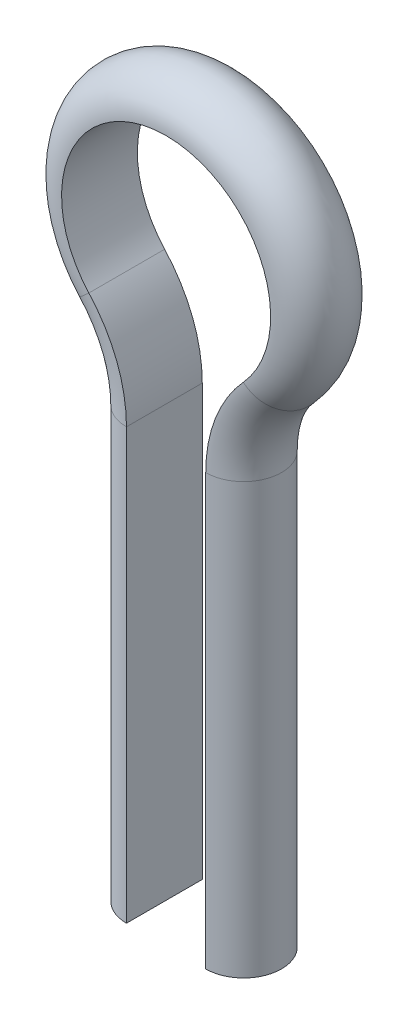
ISO-10303-21;
HEADER;
FILE_DESCRIPTION(('STEP AP214'),'2;1');
FILE_NAME('part.step','',(''),(''),'','','');
FILE_SCHEMA(('AUTOMOTIVE_DESIGN { 1 0 10303 214 1 1 1 1 }'));
ENDSEC;
DATA;
#1=APPLICATION_CONTEXT('core data for automotive mechanical design processes');
#2=APPLICATION_PROTOCOL_DEFINITION('international standard','automotive_design',2000,#1);
#3=PRODUCT_CONTEXT('',#1,'mechanical');
#4=PRODUCT('Part','Part','',(#3));
#5=PRODUCT_RELATED_PRODUCT_CATEGORY('part','',(#4));
#6=PRODUCT_DEFINITION_FORMATION('','',#4);
#7=PRODUCT_DEFINITION_CONTEXT('part definition',#1,'design');
#8=PRODUCT_DEFINITION('design','',#6,#7);
#9=PRODUCT_DEFINITION_SHAPE('','',#8);
#10=(LENGTH_UNIT() NAMED_UNIT(*) SI_UNIT(.MILLI.,.METRE.));
#11=(NAMED_UNIT(*) PLANE_ANGLE_UNIT() SI_UNIT($,.RADIAN.));
#12=(NAMED_UNIT(*) SI_UNIT($,.STERADIAN.) SOLID_ANGLE_UNIT());
#13=UNCERTAINTY_MEASURE_WITH_UNIT(LENGTH_MEASURE(1.E-05),#10,'distance_accuracy_value','');
#14=(GEOMETRIC_REPRESENTATION_CONTEXT(3) GLOBAL_UNCERTAINTY_ASSIGNED_CONTEXT((#13)) GLOBAL_UNIT_ASSIGNED_CONTEXT((#10,
#11,#12)) REPRESENTATION_CONTEXT('',''));
#15=CARTESIAN_POINT('',(0.,0.,0.));
#16=DIRECTION('',(0.,0.,1.));
#17=DIRECTION('',(1.,0.,0.));
#18=AXIS2_PLACEMENT_3D('',#15,#16,#17);
#19=CARTESIAN_POINT('',(-15.5057039775976,0.,-0.117647506402781));
#20=DIRECTION('',(0.,-1.,0.));
#21=DIRECTION('',(0.,0.,1.));
#22=AXIS2_PLACEMENT_3D('',#19,#20,#21);
#23=PLANE('',#22);
#24=CARTESIAN_POINT('',(-15.5057039775976,0.,-0.117647506402781));
#25=DIRECTION('',(0.,-1.,0.));
#26=DIRECTION('',(0.,0.,1.));
#27=AXIS2_PLACEMENT_3D('',#24,#25,#26);
#28=CIRCLE('',#27,5.17649028173649);
#29=CARTESIAN_POINT('',(-15.5057039775976,0.,5.0588427753337));
#30=VERTEX_POINT('',#29);
#31=CARTESIAN_POINT('',(-15.5057039775976,0.,-5.29413778813927));
#32=VERTEX_POINT('',#31);
#33=EDGE_CURVE('E91',#30,#32,#28,.T.);
#34=ORIENTED_EDGE('',*,*,#33,.T.);
#35=DIRECTION('',(0.,0.,1.));
#36=VECTOR('',#35,1.);
#37=CARTESIAN_POINT('',(-15.5057039775976,0.,-5.29413778813927));
#38=LINE('',#37,#36);
#39=EDGE_CURVE('E101',#32,#30,#38,.T.);
#40=ORIENTED_EDGE('',*,*,#39,.T.);
#41=EDGE_LOOP('',(#34,#40));
#42=FACE_BOUND('',#41,.T.);
#43=ADVANCED_FACE('F39',(#42),#23,.T.);
#44=CARTESIAN_POINT('',(-4.68213338851223,0.,-0.117647506402781));
#45=DIRECTION('',(0.,1.,0.));
#46=DIRECTION('',(0.,0.,1.));
#47=AXIS2_PLACEMENT_3D('',#44,#45,#46);
#48=PLANE('',#47);
#49=CARTESIAN_POINT('',(-4.68213338851223,0.,-0.117647506402781));
#50=DIRECTION('',(0.,1.,0.));
#51=DIRECTION('',(0.,0.,1.));
#52=AXIS2_PLACEMENT_3D('',#49,#50,#51);
#53=CIRCLE('',#52,5.17649028173649);
#54=CARTESIAN_POINT('',(-4.68213338851223,0.,5.0588427753337));
#55=VERTEX_POINT('',#54);
#56=CARTESIAN_POINT('',(-4.68213338851223,0.,-5.29413778813927));
#57=VERTEX_POINT('',#56);
#58=EDGE_CURVE('E54',#55,#57,#53,.T.);
#59=ORIENTED_EDGE('',*,*,#58,.F.);
#60=DIRECTION('',(0.,0.,1.));
#61=VECTOR('',#60,1.);
#62=CARTESIAN_POINT('',(-4.68213338851223,0.,-5.29413778813927));
#63=LINE('',#62,#61);
#64=EDGE_CURVE('E11',#57,#55,#63,.T.);
#65=ORIENTED_EDGE('',*,*,#64,.F.);
#66=EDGE_LOOP('',(#59,#65));
#67=FACE_BOUND('',#66,.T.);
#68=ADVANCED_FACE('F211',(#67),#48,.F.);
#69=CARTESIAN_POINT('',(-15.5057039775976,0.,-0.117647506402781));
#70=DIRECTION('',(0.,1.,0.));
#71=DIRECTION('',(0.,0.,1.));
#72=AXIS2_PLACEMENT_3D('',#69,#70,#71);
#73=CYLINDRICAL_SURFACE('',#72,5.17649028173649);
#74=DIRECTION('',(0.,1.,0.));
#75=VECTOR('',#74,1.);
#76=CARTESIAN_POINT('',(-15.5057039775976,0.,-5.29413778813927));
#77=LINE('',#76,#75);
#78=CARTESIAN_POINT('',(-15.5057039775976,58.7120116304816,-5.29413778813927));
#79=VERTEX_POINT('',#78);
#80=EDGE_CURVE('E98',#32,#79,#77,.T.);
#81=ORIENTED_EDGE('',*,*,#80,.F.);
#82=ORIENTED_EDGE('',*,*,#33,.F.);
#83=DIRECTION('',(0.,1.,0.));
#84=VECTOR('',#83,1.);
#85=CARTESIAN_POINT('',(-15.5057039775976,0.,5.0588427753337));
#86=LINE('',#85,#84);
#87=CARTESIAN_POINT('',(-15.5057039775976,58.7120116304816,5.0588427753337));
#88=VERTEX_POINT('',#87);
#89=EDGE_CURVE('E96',#30,#88,#86,.T.);
#90=ORIENTED_EDGE('',*,*,#89,.T.);
#91=CARTESIAN_POINT('',(-15.5057039775976,58.7120116304816,-0.117647506402781));
#92=DIRECTION('',(0.,-1.,0.));
#93=DIRECTION('',(0.,0.,1.));
#94=AXIS2_PLACEMENT_3D('',#91,#92,#93);
#95=CIRCLE('',#94,5.17649028173649);
#96=EDGE_CURVE('E112',#88,#79,#95,.T.);
#97=ORIENTED_EDGE('',*,*,#96,.T.);
#98=EDGE_LOOP('',(#81,#82,#90,#97));
#99=FACE_BOUND('',#98,.T.);
#100=ADVANCED_FACE('F93',(#99),#73,.T.);
#101=CARTESIAN_POINT('',(-15.5057039775976,0.,-5.29413778813927));
#102=DIRECTION('',(-1.,0.,0.));
#103=DIRECTION('',(0.,0.,1.));
#104=AXIS2_PLACEMENT_3D('',#101,#102,#103);
#105=PLANE('',#104);
#106=DIRECTION('',(0.,0.,1.));
#107=VECTOR('',#106,1.);
#108=CARTESIAN_POINT('',(-15.5057039775976,58.7120116304816,-5.29413778813927));
#109=LINE('',#108,#107);
#110=EDGE_CURVE('E109',#79,#88,#109,.T.);
#111=ORIENTED_EDGE('',*,*,#110,.T.);
#112=ORIENTED_EDGE('',*,*,#89,.F.);
#113=ORIENTED_EDGE('',*,*,#39,.F.);
#114=ORIENTED_EDGE('',*,*,#80,.T.);
#115=EDGE_LOOP('',(#111,#112,#113,#114));
#116=FACE_BOUND('',#115,.T.);
#117=ADVANCED_FACE('F107',(#116),#105,.F.);
#118=CARTESIAN_POINT('',(-35.1878373661099,58.7120116304816,-0.117647506402781));
#119=DIRECTION('',(0.,0.,1.));
#120=DIRECTION('',(1.,0.,0.));
#121=AXIS2_PLACEMENT_3D('',#118,#119,#120);
#122=TOROIDAL_SURFACE('',#121,19.6821333885122,5.17649028173649);
#123=CARTESIAN_POINT('',(-35.1878373661099,58.7120116304816,-5.29413778813927));
#124=DIRECTION('',(0.,0.,1.));
#125=DIRECTION('',(1.,0.,0.));
#126=AXIS2_PLACEMENT_3D('',#123,#124,#125);
#127=CIRCLE('',#126,19.6821333885122);
#128=CARTESIAN_POINT('',(-20.6429853097687,71.9722398857696,-5.29413778813927));
#129=VERTEX_POINT('',#128);
#130=EDGE_CURVE('E122',#79,#129,#127,.T.);
#131=ORIENTED_EDGE('',*,*,#130,.F.);
#132=ORIENTED_EDGE('',*,*,#96,.F.);
#133=CARTESIAN_POINT('',(-35.1878373661099,58.7120116304816,5.0588427753337));
#134=DIRECTION('',(0.,0.,1.));
#135=DIRECTION('',(1.,0.,0.));
#136=AXIS2_PLACEMENT_3D('',#133,#134,#135);
#137=CIRCLE('',#136,19.6821333885122);
#138=CARTESIAN_POINT('',(-20.6429853097687,71.9722398857696,5.0588427753337));
#139=VERTEX_POINT('',#138);
#140=EDGE_CURVE('E123',#88,#139,#137,.T.);
#141=ORIENTED_EDGE('',*,*,#140,.T.);
#142=CARTESIAN_POINT('',(-20.6429853097687,71.9722398857696,-0.117647506402781));
#143=DIRECTION('',(0.673719052378105,-0.738987576663335,0.));
#144=DIRECTION('',(0.,0.,1.));
#145=AXIS2_PLACEMENT_3D('',#142,#143,#144);
#146=CIRCLE('',#145,5.17649028173649);
#147=EDGE_CURVE('E118',#139,#129,#146,.T.);
#148=ORIENTED_EDGE('',*,*,#147,.T.);
#149=EDGE_LOOP('',(#131,#132,#141,#148));
#150=FACE_BOUND('',#149,.T.);
#151=ADVANCED_FACE('F191',(#150),#122,.T.);
#152=CARTESIAN_POINT('',(-35.1878373661099,58.7120116304816,0.));
#153=DIRECTION('',(0.,0.,1.));
#154=DIRECTION('',(1.,0.,0.));
#155=AXIS2_PLACEMENT_3D('',#152,#153,#154);
#156=CYLINDRICAL_SURFACE('',#155,19.6821333885122);
#157=DIRECTION('',(0.,0.,1.));
#158=VECTOR('',#157,1.);
#159=CARTESIAN_POINT('',(-20.6429853097687,71.9722398857696,-5.29413778813927));
#160=LINE('',#159,#158);
#161=EDGE_CURVE('E127',#129,#139,#160,.T.);
#162=ORIENTED_EDGE('',*,*,#161,.T.);
#163=ORIENTED_EDGE('',*,*,#140,.F.);
#164=ORIENTED_EDGE('',*,*,#110,.F.);
#165=ORIENTED_EDGE('',*,*,#130,.T.);
#166=EDGE_LOOP('',(#162,#163,#164,#165));
#167=FACE_BOUND('',#166,.T.);
#168=ADVANCED_FACE('F189',(#167),#156,.T.);
#169=CARTESIAN_POINT('',(-10.0939186830549,81.5895966528656,-0.117647506402781));
#170=DIRECTION('',(0.,0.,-1.));
#171=DIRECTION('',(-1.,0.,0.));
#172=AXIS2_PLACEMENT_3D('',#169,#170,#171);
#173=TOROIDAL_SURFACE('',#172,14.2750256700454,5.17649028173649);
#174=CARTESIAN_POINT('',(-10.0939186830549,81.5895966528656,-5.29413778813927));
#175=DIRECTION('',(0.,0.,-1.));
#176=DIRECTION('',(-0.738987576663336,-0.673719052378104,0.));
#177=AXIS2_PLACEMENT_3D('',#174,#175,#176);
#178=CIRCLE('',#177,14.2750256700454);
#179=CARTESIAN_POINT('',(0.455147943658824,71.9722398857695,-5.29413778813927));
#180=VERTEX_POINT('',#179);
#181=EDGE_CURVE('E135',#129,#180,#178,.T.);
#182=ORIENTED_EDGE('',*,*,#181,.F.);
#183=ORIENTED_EDGE('',*,*,#147,.F.);
#184=CARTESIAN_POINT('',(-10.0939186830549,81.5895966528656,5.0588427753337));
#185=DIRECTION('',(0.,0.,-1.));
#186=DIRECTION('',(-0.738987576663336,-0.673719052378104,0.));
#187=AXIS2_PLACEMENT_3D('',#184,#185,#186);
#188=CIRCLE('',#187,14.2750256700454);
#189=CARTESIAN_POINT('',(0.455147943658824,71.9722398857695,5.0588427753337));
#190=VERTEX_POINT('',#189);
#191=EDGE_CURVE('E136',#139,#190,#188,.T.);
#192=ORIENTED_EDGE('',*,*,#191,.T.);
#193=CARTESIAN_POINT('',(0.455147943658824,71.9722398857695,-0.117647506402781));
#194=DIRECTION('',(0.673719052378105,0.738987576663335,0.));
#195=DIRECTION('',(0.,0.,1.));
#196=AXIS2_PLACEMENT_3D('',#193,#194,#195);
#197=CIRCLE('',#196,5.17649028173649);
#198=EDGE_CURVE('E131',#190,#180,#197,.T.);
#199=ORIENTED_EDGE('',*,*,#198,.T.);
#200=EDGE_LOOP('',(#182,#183,#192,#199));
#201=FACE_BOUND('',#200,.T.);
#202=ADVANCED_FACE('F184',(#201),#173,.T.);
#203=CARTESIAN_POINT('',(-10.0939186830549,81.5895966528656,0.));
#204=DIRECTION('',(0.,0.,-1.));
#205=DIRECTION('',(-1.,0.,0.));
#206=AXIS2_PLACEMENT_3D('',#203,#204,#205);
#207=CYLINDRICAL_SURFACE('',#206,14.2750256700454);
#208=DIRECTION('',(0.,0.,1.));
#209=VECTOR('',#208,1.);
#210=CARTESIAN_POINT('',(0.455147943658824,71.9722398857695,-5.29413778813927));
#211=LINE('',#210,#209);
#212=EDGE_CURVE('E140',#180,#190,#211,.T.);
#213=ORIENTED_EDGE('',*,*,#212,.T.);
#214=ORIENTED_EDGE('',*,*,#191,.F.);
#215=ORIENTED_EDGE('',*,*,#161,.F.);
#216=ORIENTED_EDGE('',*,*,#181,.T.);
#217=EDGE_LOOP('',(#213,#214,#215,#216));
#218=FACE_BOUND('',#217,.T.);
#219=ADVANCED_FACE('F187',(#218),#207,.F.);
#220=CARTESIAN_POINT('',(15.,58.7120116304816,-0.117647506402781));
#221=DIRECTION('',(0.,0.,1.));
#222=DIRECTION('',(1.,0.,0.));
#223=AXIS2_PLACEMENT_3D('',#220,#221,#222);
#224=TOROIDAL_SURFACE('',#223,19.6821333885122,5.17649028173649);
#225=CARTESIAN_POINT('',(15.,58.7120116304816,-5.29413778813927));
#226=DIRECTION('',(0.,0.,1.));
#227=DIRECTION('',(-0.738987576663336,0.673719052378104,0.));
#228=AXIS2_PLACEMENT_3D('',#225,#226,#227);
#229=CIRCLE('',#228,19.6821333885122);
#230=CARTESIAN_POINT('',(-4.68213338851223,58.7120116304816,-5.29413778813927));
#231=VERTEX_POINT('',#230);
#232=EDGE_CURVE('E148',#180,#231,#229,.T.);
#233=ORIENTED_EDGE('',*,*,#232,.F.);
#234=ORIENTED_EDGE('',*,*,#198,.F.);
#235=CARTESIAN_POINT('',(15.,58.7120116304816,5.0588427753337));
#236=DIRECTION('',(0.,0.,1.));
#237=DIRECTION('',(-0.738987576663336,0.673719052378104,0.));
#238=AXIS2_PLACEMENT_3D('',#235,#236,#237);
#239=CIRCLE('',#238,19.6821333885122);
#240=CARTESIAN_POINT('',(-4.68213338851223,58.7120116304816,5.0588427753337));
#241=VERTEX_POINT('',#240);
#242=EDGE_CURVE('E149',#190,#241,#239,.T.);
#243=ORIENTED_EDGE('',*,*,#242,.T.);
#244=CARTESIAN_POINT('',(-4.68213338851223,58.7120116304816,-0.117647506402781));
#245=DIRECTION('',(0.,1.,0.));
#246=DIRECTION('',(0.,0.,1.));
#247=AXIS2_PLACEMENT_3D('',#244,#245,#246);
#248=CIRCLE('',#247,5.17649028173649);
#249=EDGE_CURVE('E144',#241,#231,#248,.T.);
#250=ORIENTED_EDGE('',*,*,#249,.T.);
#251=EDGE_LOOP('',(#233,#234,#243,#250));
#252=FACE_BOUND('',#251,.T.);
#253=ADVANCED_FACE('F181',(#252),#224,.T.);
#254=CARTESIAN_POINT('',(15.,58.7120116304816,0.));
#255=DIRECTION('',(0.,0.,1.));
#256=DIRECTION('',(1.,0.,0.));
#257=AXIS2_PLACEMENT_3D('',#254,#255,#256);
#258=CYLINDRICAL_SURFACE('',#257,19.6821333885122);
#259=DIRECTION('',(0.,0.,1.));
#260=VECTOR('',#259,1.);
#261=CARTESIAN_POINT('',(-4.68213338851223,58.7120116304816,-5.29413778813927));
#262=LINE('',#261,#260);
#263=EDGE_CURVE('E153',#231,#241,#262,.T.);
#264=ORIENTED_EDGE('',*,*,#263,.T.);
#265=ORIENTED_EDGE('',*,*,#242,.F.);
#266=ORIENTED_EDGE('',*,*,#212,.F.);
#267=ORIENTED_EDGE('',*,*,#232,.T.);
#268=EDGE_LOOP('',(#264,#265,#266,#267));
#269=FACE_BOUND('',#268,.T.);
#270=ADVANCED_FACE('F176',(#269),#258,.T.);
#271=CARTESIAN_POINT('',(-4.68213338851223,58.7120116304816,-0.117647506402781));
#272=DIRECTION('',(0.,-1.,0.));
#273=DIRECTION('',(0.,0.,-1.));
#274=AXIS2_PLACEMENT_3D('',#271,#272,#273);
#275=CYLINDRICAL_SURFACE('',#274,5.17649028173649);
#276=DIRECTION('',(0.,-1.,0.));
#277=VECTOR('',#276,1.);
#278=CARTESIAN_POINT('',(-4.68213338851223,58.7120116304816,-5.29413778813927));
#279=LINE('',#278,#277);
#280=EDGE_CURVE('E47',#231,#57,#279,.T.);
#281=ORIENTED_EDGE('',*,*,#280,.F.);
#282=ORIENTED_EDGE('',*,*,#249,.F.);
#283=DIRECTION('',(0.,-1.,0.));
#284=VECTOR('',#283,1.);
#285=CARTESIAN_POINT('',(-4.68213338851223,58.7120116304816,5.0588427753337));
#286=LINE('',#285,#284);
#287=EDGE_CURVE('E159',#241,#55,#286,.T.);
#288=ORIENTED_EDGE('',*,*,#287,.T.);
#289=ORIENTED_EDGE('',*,*,#58,.T.);
#290=EDGE_LOOP('',(#281,#282,#288,#289));
#291=FACE_BOUND('',#290,.T.);
#292=ADVANCED_FACE('F178',(#291),#275,.T.);
#293=CARTESIAN_POINT('',(-4.68213338851223,58.7120116304816,-5.29413778813927));
#294=DIRECTION('',(1.,0.,0.));
#295=DIRECTION('',(0.,0.,-1.));
#296=AXIS2_PLACEMENT_3D('',#293,#294,#295);
#297=PLANE('',#296);
#298=ORIENTED_EDGE('',*,*,#64,.T.);
#299=ORIENTED_EDGE('',*,*,#287,.F.);
#300=ORIENTED_EDGE('',*,*,#263,.F.);
#301=ORIENTED_EDGE('',*,*,#280,.T.);
#302=EDGE_LOOP('',(#298,#299,#300,#301));
#303=FACE_BOUND('',#302,.T.);
#304=ADVANCED_FACE('F202',(#303),#297,.F.);
#305=CLOSED_SHELL('',(#43,#68,#100,#117,#151,#168,#202,#219,#253,#270,#292,#304));
#306=MANIFOLD_SOLID_BREP('B2',#305);
#307=ADVANCED_BREP_SHAPE_REPRESENTATION('',(#18,#306),#14);
#308=SHAPE_DEFINITION_REPRESENTATION(#9,#307);
ENDSEC;
END-ISO-10303-21;
